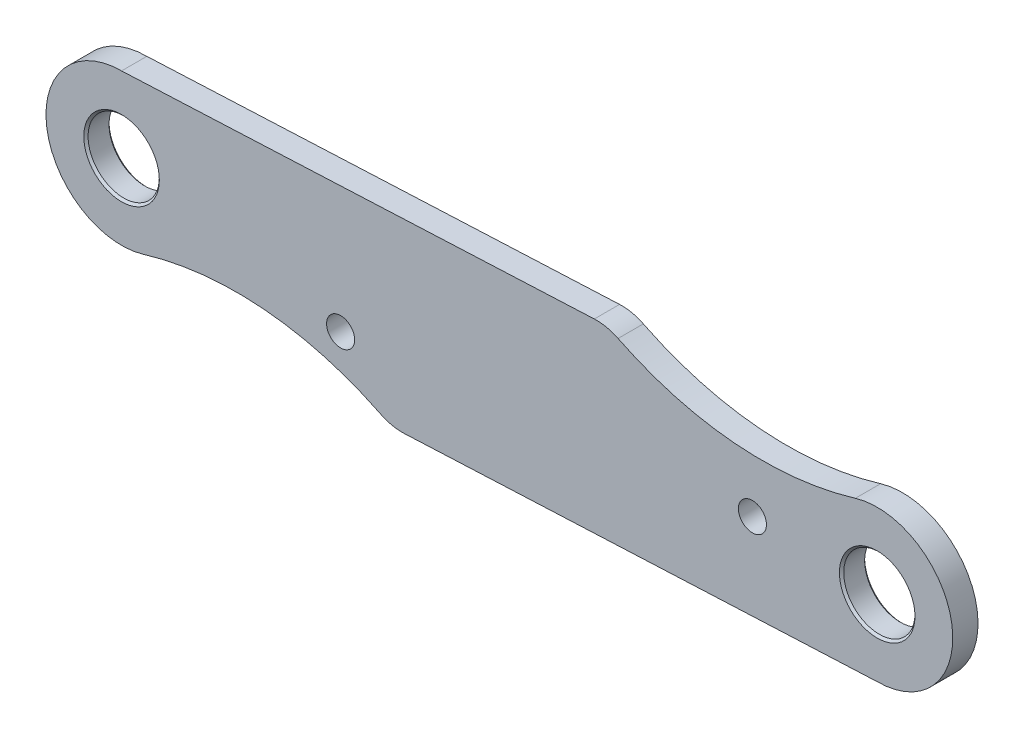
ISO-10303-21;
HEADER;
FILE_DESCRIPTION(('STEP AP214'),'2;1');
FILE_NAME('part.step','',(''),(''),'','','');
FILE_SCHEMA(('AUTOMOTIVE_DESIGN { 1 0 10303 214 1 1 1 1 }'));
ENDSEC;
DATA;
#1=APPLICATION_CONTEXT('core data for automotive mechanical design processes');
#2=APPLICATION_PROTOCOL_DEFINITION('international standard','automotive_design',2000,#1);
#3=PRODUCT_CONTEXT('',#1,'mechanical');
#4=PRODUCT('Part','Part','',(#3));
#5=PRODUCT_RELATED_PRODUCT_CATEGORY('part','',(#4));
#6=PRODUCT_DEFINITION_FORMATION('','',#4);
#7=PRODUCT_DEFINITION_CONTEXT('part definition',#1,'design');
#8=PRODUCT_DEFINITION('design','',#6,#7);
#9=PRODUCT_DEFINITION_SHAPE('','',#8);
#10=(LENGTH_UNIT() NAMED_UNIT(*) SI_UNIT(.MILLI.,.METRE.));
#11=(NAMED_UNIT(*) PLANE_ANGLE_UNIT() SI_UNIT($,.RADIAN.));
#12=(NAMED_UNIT(*) SI_UNIT($,.STERADIAN.) SOLID_ANGLE_UNIT());
#13=UNCERTAINTY_MEASURE_WITH_UNIT(LENGTH_MEASURE(1.E-05),#10,'distance_accuracy_value','');
#14=(GEOMETRIC_REPRESENTATION_CONTEXT(3) GLOBAL_UNCERTAINTY_ASSIGNED_CONTEXT((#13)) GLOBAL_UNIT_ASSIGNED_CONTEXT((#10,
#11,#12)) REPRESENTATION_CONTEXT('',''));
#15=CARTESIAN_POINT('',(0.,0.,0.));
#16=DIRECTION('',(0.,0.,1.));
#17=DIRECTION('',(1.,0.,0.));
#18=AXIS2_PLACEMENT_3D('',#15,#16,#17);
#19=CARTESIAN_POINT('',(144.714118455406,0.,11.7));
#20=DIRECTION('',(0.,0.,1.));
#21=DIRECTION('',(1.,0.,0.));
#22=AXIS2_PLACEMENT_3D('',#19,#20,#21);
#23=PLANE('',#22);
#24=CARTESIAN_POINT('',(-73.5345799424602,-18.9015484166511,11.7));
#25=DIRECTION('',(0.,0.,1.));
#26=DIRECTION('',(1.,0.,0.));
#27=AXIS2_PLACEMENT_3D('',#24,#25,#26);
#28=CIRCLE('',#27,6.5);
#29=CARTESIAN_POINT('',(-67.0345799424602,-18.9015484166511,11.7));
#30=VERTEX_POINT('',#29);
#31=EDGE_CURVE('E258',#30,#30,#28,.F.);
#32=ORIENTED_EDGE('',*,*,#31,.T.);
#33=EDGE_LOOP('',(#32));
#34=FACE_BOUND('',#33,.T.);
#35=CARTESIAN_POINT('',(117.200528876991,2.3014316482371,11.7));
#36=DIRECTION('',(0.,0.,1.));
#37=DIRECTION('',(1.,0.,0.));
#38=AXIS2_PLACEMENT_3D('',#35,#36,#37);
#39=CIRCLE('',#38,6.50000000000002);
#40=CARTESIAN_POINT('',(123.700528876991,2.3014316482371,11.7));
#41=VERTEX_POINT('',#40);
#42=EDGE_CURVE('E267',#41,#41,#39,.F.);
#43=ORIENTED_EDGE('',*,*,#42,.T.);
#44=EDGE_LOOP('',(#43));
#45=FACE_BOUND('',#44,.T.);
#46=CARTESIAN_POINT('',(175.,0.,11.7));
#47=DIRECTION('',(0.,0.,1.));
#48=DIRECTION('',(1.,0.,0.));
#49=AXIS2_PLACEMENT_3D('',#46,#47,#48);
#50=CIRCLE('',#49,17.5000000000001);
#51=CARTESIAN_POINT('',(192.5,0.,11.7));
#52=VERTEX_POINT('',#51);
#53=EDGE_CURVE('E158',#52,#52,#50,.F.);
#54=ORIENTED_EDGE('',*,*,#53,.T.);
#55=EDGE_LOOP('',(#54));
#56=FACE_BOUND('',#55,.T.);
#57=CARTESIAN_POINT('',(-175.,0.,11.7));
#58=DIRECTION('',(0.,0.,1.));
#59=DIRECTION('',(1.,0.,0.));
#60=AXIS2_PLACEMENT_3D('',#57,#58,#59);
#61=CIRCLE('',#60,17.5000000000001);
#62=CARTESIAN_POINT('',(-157.5,0.,11.7));
#63=VERTEX_POINT('',#62);
#64=EDGE_CURVE('E155',#63,#63,#61,.F.);
#65=ORIENTED_EDGE('',*,*,#64,.T.);
#66=EDGE_LOOP('',(#65));
#67=FACE_BOUND('',#66,.T.);
#68=DIRECTION('',(-0.998963727160202,-0.0455134245931705,0.));
#69=VECTOR('',#68,1.);
#70=CARTESIAN_POINT('',(1.95382667754433,-42.8840940331613,11.7));
#71=LINE('',#70,#69);
#72=CARTESIAN_POINT('',(175.,-35.,11.7));
#73=VERTEX_POINT('',#72);
#74=CARTESIAN_POINT('',(-43.9759479466537,-44.9766838611046,11.7));
#75=VERTEX_POINT('',#74);
#76=EDGE_CURVE('E138',#73,#75,#71,.T.);
#77=ORIENTED_EDGE('',*,*,#76,.F.);
#78=CARTESIAN_POINT('',(175.,0.,11.7));
#79=DIRECTION('',(0.,0.,1.));
#80=DIRECTION('',(1.,0.,0.));
#81=AXIS2_PLACEMENT_3D('',#78,#79,#80);
#82=CIRCLE('',#81,35.);
#83=CARTESIAN_POINT('',(164.881671498375,33.505513402024,11.7));
#84=VERTEX_POINT('',#83);
#85=EDGE_CURVE('E134',#73,#84,#82,.T.);
#86=ORIENTED_EDGE('',*,*,#85,.T.);
#87=CARTESIAN_POINT('',(121.517406491412,177.10057083927,11.7));
#88=DIRECTION('',(0.,0.,1.));
#89=DIRECTION('',(1.,0.,0.));
#90=AXIS2_PLACEMENT_3D('',#87,#88,#89);
#91=CIRCLE('',#90,150.);
#92=CARTESIAN_POINT('',(54.9805312814885,42.6652918486004,11.7));
#93=VERTEX_POINT('',#92);
#94=EDGE_CURVE('E127',#93,#84,#91,.T.);
#95=ORIENTED_EDGE('',*,*,#94,.F.);
#96=CARTESIAN_POINT('',(45.,22.5,11.7));
#97=DIRECTION('',(0.,0.,1.));
#98=DIRECTION('',(1.,0.,0.));
#99=AXIS2_PLACEMENT_3D('',#96,#97,#98);
#100=CIRCLE('',#99,22.5);
#101=CARTESIAN_POINT('',(43.9759479466537,44.9766838611046,11.7));
#102=VERTEX_POINT('',#101);
#103=EDGE_CURVE('E126',#93,#102,#100,.T.);
#104=ORIENTED_EDGE('',*,*,#103,.T.);
#105=DIRECTION('',(0.998963727160202,0.0455134245931705,0.));
#106=VECTOR('',#105,1.);
#107=CARTESIAN_POINT('',(-1.95382667754433,42.8840940331613,11.7));
#108=LINE('',#107,#106);
#109=CARTESIAN_POINT('',(-175.,35.,11.7));
#110=VERTEX_POINT('',#109);
#111=EDGE_CURVE('E278',#110,#102,#108,.T.);
#112=ORIENTED_EDGE('',*,*,#111,.F.);
#113=CARTESIAN_POINT('',(-175.,0.,11.7));
#114=DIRECTION('',(0.,0.,1.));
#115=DIRECTION('',(1.,0.,0.));
#116=AXIS2_PLACEMENT_3D('',#113,#114,#115);
#117=CIRCLE('',#116,35.);
#118=CARTESIAN_POINT('',(-164.881671498375,-33.505513402024,11.7));
#119=VERTEX_POINT('',#118);
#120=EDGE_CURVE('E275',#110,#119,#117,.T.);
#121=ORIENTED_EDGE('',*,*,#120,.T.);
#122=CARTESIAN_POINT('',(-121.517406491412,-177.10057083927,11.7));
#123=DIRECTION('',(0.,0.,1.));
#124=DIRECTION('',(1.,0.,0.));
#125=AXIS2_PLACEMENT_3D('',#122,#123,#124);
#126=CIRCLE('',#125,150.);
#127=CARTESIAN_POINT('',(-54.9805312814886,-42.6652918486004,11.7));
#128=VERTEX_POINT('',#127);
#129=EDGE_CURVE('E272',#119,#128,#126,.F.);
#130=ORIENTED_EDGE('',*,*,#129,.T.);
#131=CARTESIAN_POINT('',(-45.,-22.5,11.7));
#132=DIRECTION('',(0.,0.,1.));
#133=DIRECTION('',(1.,0.,0.));
#134=AXIS2_PLACEMENT_3D('',#131,#132,#133);
#135=CIRCLE('',#134,22.5);
#136=EDGE_CURVE('E142',#128,#75,#135,.T.);
#137=ORIENTED_EDGE('',*,*,#136,.T.);
#138=EDGE_LOOP('',(#77,#86,#95,#104,#112,#121,#130,#137));
#139=FACE_BOUND('',#138,.T.);
#140=ADVANCED_FACE('F37',(#34,#45,#56,#67,#139),#23,.T.);
#141=CARTESIAN_POINT('',(144.714118455406,0.,0.));
#142=DIRECTION('',(0.,0.,1.));
#143=DIRECTION('',(1.,0.,0.));
#144=AXIS2_PLACEMENT_3D('',#141,#142,#143);
#145=PLANE('',#144);
#146=CARTESIAN_POINT('',(-73.5345799424602,-18.9015484166511,0.));
#147=DIRECTION('',(0.,0.,-1.));
#148=DIRECTION('',(-1.,0.,0.));
#149=AXIS2_PLACEMENT_3D('',#146,#147,#148);
#150=CIRCLE('',#149,6.5);
#151=CARTESIAN_POINT('',(-80.0345799424602,-18.9015484166511,0.));
#152=VERTEX_POINT('',#151);
#153=EDGE_CURVE('E140',#152,#152,#150,.T.);
#154=ORIENTED_EDGE('',*,*,#153,.F.);
#155=EDGE_LOOP('',(#154));
#156=FACE_BOUND('',#155,.T.);
#157=CARTESIAN_POINT('',(117.200528876991,2.3014316482371,0.));
#158=DIRECTION('',(0.,0.,-1.));
#159=DIRECTION('',(-1.,0.,0.));
#160=AXIS2_PLACEMENT_3D('',#157,#158,#159);
#161=CIRCLE('',#160,6.50000000000002);
#162=CARTESIAN_POINT('',(110.700528876991,2.3014316482371,0.));
#163=VERTEX_POINT('',#162);
#164=EDGE_CURVE('E262',#163,#163,#161,.T.);
#165=ORIENTED_EDGE('',*,*,#164,.F.);
#166=EDGE_LOOP('',(#165));
#167=FACE_BOUND('',#166,.T.);
#168=CARTESIAN_POINT('',(-175.,0.,0.));
#169=DIRECTION('',(0.,0.,1.));
#170=DIRECTION('',(1.,0.,0.));
#171=AXIS2_PLACEMENT_3D('',#168,#169,#170);
#172=CIRCLE('',#171,17.5000000000001);
#173=CARTESIAN_POINT('',(-157.5,0.,0.));
#174=VERTEX_POINT('',#173);
#175=EDGE_CURVE('E11',#174,#174,#172,.T.);
#176=ORIENTED_EDGE('',*,*,#175,.T.);
#177=EDGE_LOOP('',(#176));
#178=FACE_BOUND('',#177,.T.);
#179=CARTESIAN_POINT('',(175.,0.,0.));
#180=DIRECTION('',(0.,0.,1.));
#181=DIRECTION('',(1.,0.,0.));
#182=AXIS2_PLACEMENT_3D('',#179,#180,#181);
#183=CIRCLE('',#182,17.5000000000001);
#184=CARTESIAN_POINT('',(192.5,0.,0.));
#185=VERTEX_POINT('',#184);
#186=EDGE_CURVE('E46',#185,#185,#183,.T.);
#187=ORIENTED_EDGE('',*,*,#186,.T.);
#188=EDGE_LOOP('',(#187));
#189=FACE_BOUND('',#188,.T.);
#190=CARTESIAN_POINT('',(-45.,-22.5,0.));
#191=DIRECTION('',(0.,0.,1.));
#192=DIRECTION('',(1.,0.,0.));
#193=AXIS2_PLACEMENT_3D('',#190,#191,#192);
#194=CIRCLE('',#193,22.5);
#195=CARTESIAN_POINT('',(-43.9759479466537,-44.9766838611046,0.));
#196=VERTEX_POINT('',#195);
#197=CARTESIAN_POINT('',(-54.9805312814886,-42.6652918486004,0.));
#198=VERTEX_POINT('',#197);
#199=EDGE_CURVE('E92',#196,#198,#194,.F.);
#200=ORIENTED_EDGE('',*,*,#199,.T.);
#201=CARTESIAN_POINT('',(-121.517406491412,-177.10057083927,0.));
#202=DIRECTION('',(0.,0.,1.));
#203=DIRECTION('',(1.,0.,0.));
#204=AXIS2_PLACEMENT_3D('',#201,#202,#203);
#205=CIRCLE('',#204,150.);
#206=CARTESIAN_POINT('',(-164.881671498375,-33.505513402024,0.));
#207=VERTEX_POINT('',#206);
#208=EDGE_CURVE('E96',#198,#207,#205,.T.);
#209=ORIENTED_EDGE('',*,*,#208,.T.);
#210=CARTESIAN_POINT('',(-175.,0.,0.));
#211=DIRECTION('',(0.,0.,1.));
#212=DIRECTION('',(1.,0.,0.));
#213=AXIS2_PLACEMENT_3D('',#210,#211,#212);
#214=CIRCLE('',#213,35.);
#215=CARTESIAN_POINT('',(-175.,35.,0.));
#216=VERTEX_POINT('',#215);
#217=EDGE_CURVE('E115',#207,#216,#214,.F.);
#218=ORIENTED_EDGE('',*,*,#217,.T.);
#219=DIRECTION('',(-0.998963727160202,-0.0455134245931705,0.));
#220=VECTOR('',#219,1.);
#221=CARTESIAN_POINT('',(-1.95382667754433,42.8840940331613,0.));
#222=LINE('',#221,#220);
#223=CARTESIAN_POINT('',(43.9759479466537,44.9766838611046,0.));
#224=VERTEX_POINT('',#223);
#225=EDGE_CURVE('E110',#224,#216,#222,.T.);
#226=ORIENTED_EDGE('',*,*,#225,.F.);
#227=CARTESIAN_POINT('',(45.,22.5,0.));
#228=DIRECTION('',(0.,0.,1.));
#229=DIRECTION('',(1.,0.,0.));
#230=AXIS2_PLACEMENT_3D('',#227,#228,#229);
#231=CIRCLE('',#230,22.5);
#232=CARTESIAN_POINT('',(54.9805312814886,42.6652918486005,0.));
#233=VERTEX_POINT('',#232);
#234=EDGE_CURVE('E105',#224,#233,#231,.F.);
#235=ORIENTED_EDGE('',*,*,#234,.T.);
#236=CARTESIAN_POINT('',(121.517406491412,177.10057083927,0.));
#237=DIRECTION('',(0.,0.,1.));
#238=DIRECTION('',(1.,0.,0.));
#239=AXIS2_PLACEMENT_3D('',#236,#237,#238);
#240=CIRCLE('',#239,150.);
#241=CARTESIAN_POINT('',(164.881671498375,33.505513402024,-1.11022302462516E-13));
#242=VERTEX_POINT('',#241);
#243=EDGE_CURVE('E108',#242,#233,#240,.F.);
#244=ORIENTED_EDGE('',*,*,#243,.F.);
#245=CARTESIAN_POINT('',(175.,0.,0.));
#246=DIRECTION('',(0.,0.,1.));
#247=DIRECTION('',(1.,0.,0.));
#248=AXIS2_PLACEMENT_3D('',#245,#246,#247);
#249=CIRCLE('',#248,35.);
#250=CARTESIAN_POINT('',(175.,-35.,0.));
#251=VERTEX_POINT('',#250);
#252=EDGE_CURVE('E114',#242,#251,#249,.F.);
#253=ORIENTED_EDGE('',*,*,#252,.T.);
#254=DIRECTION('',(0.998963727160202,0.0455134245931705,0.));
#255=VECTOR('',#254,1.);
#256=CARTESIAN_POINT('',(1.95382667754433,-42.8840940331613,0.));
#257=LINE('',#256,#255);
#258=EDGE_CURVE('E54',#196,#251,#257,.T.);
#259=ORIENTED_EDGE('',*,*,#258,.F.);
#260=EDGE_LOOP('',(#200,#209,#218,#226,#235,#244,#253,#259));
#261=FACE_BOUND('',#260,.T.);
#262=ADVANCED_FACE('F107',(#156,#167,#178,#189,#261),#145,.F.);
#263=CARTESIAN_POINT('',(-175.,0.,11.7));
#264=DIRECTION('',(0.,0.,-1.));
#265=DIRECTION('',(-1.,0.,0.));
#266=AXIS2_PLACEMENT_3D('',#263,#264,#265);
#267=CYLINDRICAL_SURFACE('',#266,16.5);
#268=CARTESIAN_POINT('',(-175.,0.,10.6999999999999));
#269=DIRECTION('',(0.,0.,1.));
#270=DIRECTION('',(1.,0.,0.));
#271=AXIS2_PLACEMENT_3D('',#268,#269,#270);
#272=CIRCLE('',#271,16.5);
#273=CARTESIAN_POINT('',(-158.5,0.,10.6999999999999));
#274=VERTEX_POINT('',#273);
#275=EDGE_CURVE('E164',#274,#274,#272,.T.);
#276=ORIENTED_EDGE('',*,*,#275,.T.);
#277=EDGE_LOOP('',(#276));
#278=FACE_BOUND('',#277,.T.);
#279=CARTESIAN_POINT('',(-175.,0.,1.00000000000005));
#280=DIRECTION('',(0.,0.,1.));
#281=DIRECTION('',(1.,0.,0.));
#282=AXIS2_PLACEMENT_3D('',#279,#280,#281);
#283=CIRCLE('',#282,16.5);
#284=CARTESIAN_POINT('',(-158.5,0.,1.00000000000005));
#285=VERTEX_POINT('',#284);
#286=EDGE_CURVE('E161',#285,#285,#283,.F.);
#287=ORIENTED_EDGE('',*,*,#286,.T.);
#288=EDGE_LOOP('',(#287));
#289=FACE_BOUND('',#288,.T.);
#290=ADVANCED_FACE('F190',(#278,#289),#267,.F.);
#291=CARTESIAN_POINT('',(175.,0.,11.7));
#292=DIRECTION('',(0.,0.,-1.));
#293=DIRECTION('',(-1.,0.,0.));
#294=AXIS2_PLACEMENT_3D('',#291,#292,#293);
#295=CYLINDRICAL_SURFACE('',#294,16.5);
#296=CARTESIAN_POINT('',(175.,0.,10.6999999999999));
#297=DIRECTION('',(0.,0.,1.));
#298=DIRECTION('',(1.,0.,0.));
#299=AXIS2_PLACEMENT_3D('',#296,#297,#298);
#300=CIRCLE('',#299,16.5);
#301=CARTESIAN_POINT('',(191.5,0.,10.6999999999999));
#302=VERTEX_POINT('',#301);
#303=EDGE_CURVE('E152',#302,#302,#300,.T.);
#304=ORIENTED_EDGE('',*,*,#303,.T.);
#305=EDGE_LOOP('',(#304));
#306=FACE_BOUND('',#305,.T.);
#307=CARTESIAN_POINT('',(175.,0.,1.00000000000005));
#308=DIRECTION('',(0.,0.,1.));
#309=DIRECTION('',(1.,0.,0.));
#310=AXIS2_PLACEMENT_3D('',#307,#308,#309);
#311=CIRCLE('',#310,16.5);
#312=CARTESIAN_POINT('',(191.5,0.,1.00000000000005));
#313=VERTEX_POINT('',#312);
#314=EDGE_CURVE('E149',#313,#313,#311,.F.);
#315=ORIENTED_EDGE('',*,*,#314,.T.);
#316=EDGE_LOOP('',(#315));
#317=FACE_BOUND('',#316,.T.);
#318=ADVANCED_FACE('F213',(#306,#317),#295,.F.);
#319=CARTESIAN_POINT('',(1.95382667754433,-42.8840940331613,-429.534631898291));
#320=DIRECTION('',(-0.0455134245931705,0.998963727160202,0.));
#321=DIRECTION('',(-0.998963727160202,-0.0455134245931705,0.));
#322=AXIS2_PLACEMENT_3D('',#319,#320,#321);
#323=PLANE('',#322);
#324=DIRECTION('',(0.,0.,1.));
#325=VECTOR('',#324,1.);
#326=CARTESIAN_POINT('',(-43.9759479466537,-44.9766838611046,-429.534631898291));
#327=LINE('',#326,#325);
#328=EDGE_CURVE('E286',#196,#75,#327,.T.);
#329=ORIENTED_EDGE('',*,*,#328,.F.);
#330=ORIENTED_EDGE('',*,*,#258,.T.);
#331=DIRECTION('',(0.,0.,1.));
#332=VECTOR('',#331,1.);
#333=CARTESIAN_POINT('',(175.,-35.,-429.534631898291));
#334=LINE('',#333,#332);
#335=EDGE_CURVE('E135',#251,#73,#334,.T.);
#336=ORIENTED_EDGE('',*,*,#335,.T.);
#337=ORIENTED_EDGE('',*,*,#76,.T.);
#338=EDGE_LOOP('',(#329,#330,#336,#337));
#339=FACE_BOUND('',#338,.T.);
#340=ADVANCED_FACE('F221',(#339),#323,.F.);
#341=CARTESIAN_POINT('',(-45.,-22.5,-429.534631898291));
#342=DIRECTION('',(0.,0.,1.));
#343=DIRECTION('',(1.,0.,0.));
#344=AXIS2_PLACEMENT_3D('',#341,#342,#343);
#345=CYLINDRICAL_SURFACE('',#344,22.5);
#346=ORIENTED_EDGE('',*,*,#199,.F.);
#347=ORIENTED_EDGE('',*,*,#328,.T.);
#348=ORIENTED_EDGE('',*,*,#136,.F.);
#349=DIRECTION('',(0.,0.,1.));
#350=VECTOR('',#349,1.);
#351=CARTESIAN_POINT('',(-54.9805312814886,-42.6652918486004,-429.534631898291));
#352=LINE('',#351,#350);
#353=EDGE_CURVE('E288',#198,#128,#352,.T.);
#354=ORIENTED_EDGE('',*,*,#353,.F.);
#355=EDGE_LOOP('',(#346,#347,#348,#354));
#356=FACE_BOUND('',#355,.T.);
#357=ADVANCED_FACE('F226',(#356),#345,.T.);
#358=CARTESIAN_POINT('',(-121.517406491412,-177.10057083927,-429.534631898291));
#359=DIRECTION('',(0.,0.,1.));
#360=DIRECTION('',(1.,0.,0.));
#361=AXIS2_PLACEMENT_3D('',#358,#359,#360);
#362=CYLINDRICAL_SURFACE('',#361,150.);
#363=ORIENTED_EDGE('',*,*,#208,.F.);
#364=ORIENTED_EDGE('',*,*,#353,.T.);
#365=ORIENTED_EDGE('',*,*,#129,.F.);
#366=DIRECTION('',(0.,0.,1.));
#367=VECTOR('',#366,1.);
#368=CARTESIAN_POINT('',(-164.881671498375,-33.505513402024,-429.534631898291));
#369=LINE('',#368,#367);
#370=EDGE_CURVE('E146',#207,#119,#369,.T.);
#371=ORIENTED_EDGE('',*,*,#370,.F.);
#372=EDGE_LOOP('',(#363,#364,#365,#371));
#373=FACE_BOUND('',#372,.T.);
#374=ADVANCED_FACE('F233',(#373),#362,.F.);
#375=CARTESIAN_POINT('',(-175.,0.,-429.534631898291));
#376=DIRECTION('',(0.,0.,1.));
#377=DIRECTION('',(1.,0.,0.));
#378=AXIS2_PLACEMENT_3D('',#375,#376,#377);
#379=CYLINDRICAL_SURFACE('',#378,35.);
#380=ORIENTED_EDGE('',*,*,#217,.F.);
#381=ORIENTED_EDGE('',*,*,#370,.T.);
#382=ORIENTED_EDGE('',*,*,#120,.F.);
#383=DIRECTION('',(0.,0.,1.));
#384=VECTOR('',#383,1.);
#385=CARTESIAN_POINT('',(-175.,35.,-429.534631898291));
#386=LINE('',#385,#384);
#387=EDGE_CURVE('E145',#216,#110,#386,.T.);
#388=ORIENTED_EDGE('',*,*,#387,.F.);
#389=EDGE_LOOP('',(#380,#381,#382,#388));
#390=FACE_BOUND('',#389,.T.);
#391=ADVANCED_FACE('F237',(#390),#379,.T.);
#392=CARTESIAN_POINT('',(-1.95382667754433,42.8840940331613,-429.534631898291));
#393=DIRECTION('',(0.0455134245931705,-0.998963727160202,0.));
#394=DIRECTION('',(0.998963727160202,0.0455134245931705,0.));
#395=AXIS2_PLACEMENT_3D('',#392,#393,#394);
#396=PLANE('',#395);
#397=DIRECTION('',(0.,0.,1.));
#398=VECTOR('',#397,1.);
#399=CARTESIAN_POINT('',(43.9759479466537,44.9766838611046,-429.534631898291));
#400=LINE('',#399,#398);
#401=EDGE_CURVE('E121',#224,#102,#400,.T.);
#402=ORIENTED_EDGE('',*,*,#401,.F.);
#403=ORIENTED_EDGE('',*,*,#225,.T.);
#404=ORIENTED_EDGE('',*,*,#387,.T.);
#405=ORIENTED_EDGE('',*,*,#111,.T.);
#406=EDGE_LOOP('',(#402,#403,#404,#405));
#407=FACE_BOUND('',#406,.T.);
#408=ADVANCED_FACE('F241',(#407),#396,.F.);
#409=CARTESIAN_POINT('',(45.,22.5,-429.534631898291));
#410=DIRECTION('',(0.,0.,1.));
#411=DIRECTION('',(1.,0.,0.));
#412=AXIS2_PLACEMENT_3D('',#409,#410,#411);
#413=CYLINDRICAL_SURFACE('',#412,22.5);
#414=ORIENTED_EDGE('',*,*,#234,.F.);
#415=ORIENTED_EDGE('',*,*,#401,.T.);
#416=ORIENTED_EDGE('',*,*,#103,.F.);
#417=DIRECTION('',(0.,0.,1.));
#418=VECTOR('',#417,1.);
#419=CARTESIAN_POINT('',(54.9805312814885,42.6652918486004,-429.534631898291));
#420=LINE('',#419,#418);
#421=EDGE_CURVE('E119',#233,#93,#420,.T.);
#422=ORIENTED_EDGE('',*,*,#421,.F.);
#423=EDGE_LOOP('',(#414,#415,#416,#422));
#424=FACE_BOUND('',#423,.T.);
#425=ADVANCED_FACE('F124',(#424),#413,.T.);
#426=CARTESIAN_POINT('',(121.517406491412,177.10057083927,-429.534631898291));
#427=DIRECTION('',(0.,0.,1.));
#428=DIRECTION('',(1.,0.,0.));
#429=AXIS2_PLACEMENT_3D('',#426,#427,#428);
#430=CYLINDRICAL_SURFACE('',#429,150.);
#431=DIRECTION('',(0.,0.,1.));
#432=VECTOR('',#431,1.);
#433=CARTESIAN_POINT('',(164.881671498375,33.505513402024,-429.534631898291));
#434=LINE('',#433,#432);
#435=EDGE_CURVE('E88',#242,#84,#434,.T.);
#436=ORIENTED_EDGE('',*,*,#435,.F.);
#437=ORIENTED_EDGE('',*,*,#243,.T.);
#438=ORIENTED_EDGE('',*,*,#421,.T.);
#439=ORIENTED_EDGE('',*,*,#94,.T.);
#440=EDGE_LOOP('',(#436,#437,#438,#439));
#441=FACE_BOUND('',#440,.T.);
#442=ADVANCED_FACE('F118',(#441),#430,.F.);
#443=CARTESIAN_POINT('',(175.,0.,-429.534631898291));
#444=DIRECTION('',(0.,0.,1.));
#445=DIRECTION('',(1.,0.,0.));
#446=AXIS2_PLACEMENT_3D('',#443,#444,#445);
#447=CYLINDRICAL_SURFACE('',#446,35.);
#448=ORIENTED_EDGE('',*,*,#252,.F.);
#449=ORIENTED_EDGE('',*,*,#435,.T.);
#450=ORIENTED_EDGE('',*,*,#85,.F.);
#451=ORIENTED_EDGE('',*,*,#335,.F.);
#452=EDGE_LOOP('',(#448,#449,#450,#451));
#453=FACE_BOUND('',#452,.T.);
#454=ADVANCED_FACE('F201',(#453),#447,.T.);
#455=CARTESIAN_POINT('',(175.,0.,10.6999999999999));
#456=DIRECTION('',(0.,0.,1.));
#457=DIRECTION('',(1.,0.,0.));
#458=AXIS2_PLACEMENT_3D('',#455,#456,#457);
#459=CONICAL_SURFACE('',#458,16.5,0.785398163397448);
#460=ORIENTED_EDGE('',*,*,#53,.F.);
#461=EDGE_LOOP('',(#460));
#462=FACE_BOUND('',#461,.T.);
#463=ORIENTED_EDGE('',*,*,#303,.F.);
#464=EDGE_LOOP('',(#463));
#465=FACE_BOUND('',#464,.T.);
#466=ADVANCED_FACE('F198',(#462,#465),#459,.F.);
#467=CARTESIAN_POINT('',(-175.,0.,10.6999999999999));
#468=DIRECTION('',(0.,0.,1.));
#469=DIRECTION('',(1.,0.,0.));
#470=AXIS2_PLACEMENT_3D('',#467,#468,#469);
#471=CONICAL_SURFACE('',#470,16.5,0.785398163397448);
#472=ORIENTED_EDGE('',*,*,#64,.F.);
#473=EDGE_LOOP('',(#472));
#474=FACE_BOUND('',#473,.T.);
#475=ORIENTED_EDGE('',*,*,#275,.F.);
#476=EDGE_LOOP('',(#475));
#477=FACE_BOUND('',#476,.T.);
#478=ADVANCED_FACE('F181',(#474,#477),#471,.F.);
#479=CARTESIAN_POINT('',(-175.,0.,0.));
#480=DIRECTION('',(0.,0.,-1.));
#481=DIRECTION('',(-1.,0.,0.));
#482=AXIS2_PLACEMENT_3D('',#479,#480,#481);
#483=CONICAL_SURFACE('',#482,17.5000000000001,0.785398163397448);
#484=ORIENTED_EDGE('',*,*,#286,.F.);
#485=EDGE_LOOP('',(#484));
#486=FACE_BOUND('',#485,.T.);
#487=ORIENTED_EDGE('',*,*,#175,.F.);
#488=EDGE_LOOP('',(#487));
#489=FACE_BOUND('',#488,.T.);
#490=ADVANCED_FACE('F172',(#486,#489),#483,.F.);
#491=CARTESIAN_POINT('',(175.,0.,0.));
#492=DIRECTION('',(0.,0.,-1.));
#493=DIRECTION('',(-1.,0.,0.));
#494=AXIS2_PLACEMENT_3D('',#491,#492,#493);
#495=CONICAL_SURFACE('',#494,17.5000000000001,0.785398163397448);
#496=ORIENTED_EDGE('',*,*,#314,.F.);
#497=EDGE_LOOP('',(#496));
#498=FACE_BOUND('',#497,.T.);
#499=ORIENTED_EDGE('',*,*,#186,.F.);
#500=EDGE_LOOP('',(#499));
#501=FACE_BOUND('',#500,.T.);
#502=ADVANCED_FACE('F39',(#498,#501),#495,.F.);
#503=CARTESIAN_POINT('',(117.200528876991,2.3014316482371,11.701));
#504=DIRECTION('',(0.,0.,-1.));
#505=DIRECTION('',(-1.,0.,0.));
#506=AXIS2_PLACEMENT_3D('',#503,#504,#505);
#507=CYLINDRICAL_SURFACE('',#506,6.50000000000002);
#508=ORIENTED_EDGE('',*,*,#42,.F.);
#509=EDGE_LOOP('',(#508));
#510=FACE_BOUND('',#509,.T.);
#511=ORIENTED_EDGE('',*,*,#164,.T.);
#512=EDGE_LOOP('',(#511));
#513=FACE_BOUND('',#512,.T.);
#514=ADVANCED_FACE('F171',(#510,#513),#507,.F.);
#515=CARTESIAN_POINT('',(-73.5345799424602,-18.9015484166511,11.701));
#516=DIRECTION('',(0.,0.,-1.));
#517=DIRECTION('',(-1.,0.,0.));
#518=AXIS2_PLACEMENT_3D('',#515,#516,#517);
#519=CYLINDRICAL_SURFACE('',#518,6.5);
#520=ORIENTED_EDGE('',*,*,#31,.F.);
#521=EDGE_LOOP('',(#520));
#522=FACE_BOUND('',#521,.T.);
#523=ORIENTED_EDGE('',*,*,#153,.T.);
#524=EDGE_LOOP('',(#523));
#525=FACE_BOUND('',#524,.T.);
#526=ADVANCED_FACE('F178',(#522,#525),#519,.F.);
#527=CLOSED_SHELL('',(#140,#262,#290,#318,#340,#357,#374,#391,#408,#425,#442,#454,#466,#478,
#490,#502,#514,#526));
#528=MANIFOLD_SOLID_BREP('B2',#527);
#529=ADVANCED_BREP_SHAPE_REPRESENTATION('',(#18,#528),#14);
#530=SHAPE_DEFINITION_REPRESENTATION(#9,#529);
ENDSEC;
END-ISO-10303-21;
